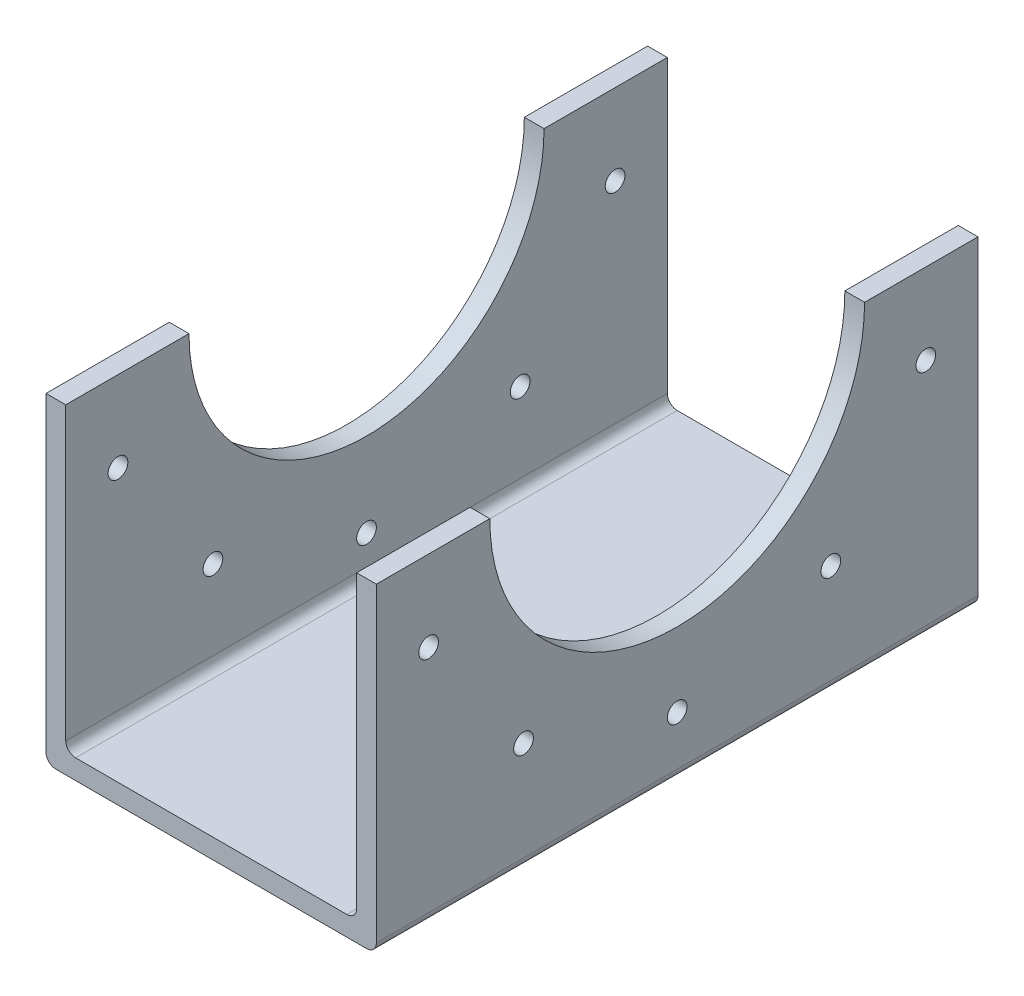
ISO-10303-21;
HEADER;
FILE_DESCRIPTION(('STEP AP214'),'2;1');
FILE_NAME('part.step','',(''),(''),'','','');
FILE_SCHEMA(('AUTOMOTIVE_DESIGN { 1 0 10303 214 1 1 1 1 }'));
ENDSEC;
DATA;
#1=APPLICATION_CONTEXT('core data for automotive mechanical design processes');
#2=APPLICATION_PROTOCOL_DEFINITION('international standard','automotive_design',2000,#1);
#3=PRODUCT_CONTEXT('',#1,'mechanical');
#4=PRODUCT('Part','Part','',(#3));
#5=PRODUCT_RELATED_PRODUCT_CATEGORY('part','',(#4));
#6=PRODUCT_DEFINITION_FORMATION('','',#4);
#7=PRODUCT_DEFINITION_CONTEXT('part definition',#1,'design');
#8=PRODUCT_DEFINITION('design','',#6,#7);
#9=PRODUCT_DEFINITION_SHAPE('','',#8);
#10=(LENGTH_UNIT() NAMED_UNIT(*) SI_UNIT(.MILLI.,.METRE.));
#11=(NAMED_UNIT(*) PLANE_ANGLE_UNIT() SI_UNIT($,.RADIAN.));
#12=(NAMED_UNIT(*) SI_UNIT($,.STERADIAN.) SOLID_ANGLE_UNIT());
#13=UNCERTAINTY_MEASURE_WITH_UNIT(LENGTH_MEASURE(1.E-05),#10,'distance_accuracy_value','');
#14=(GEOMETRIC_REPRESENTATION_CONTEXT(3) GLOBAL_UNCERTAINTY_ASSIGNED_CONTEXT((#13)) GLOBAL_UNIT_ASSIGNED_CONTEXT((#10,
#11,#12)) REPRESENTATION_CONTEXT('',''));
#15=CARTESIAN_POINT('',(0.,0.,0.));
#16=DIRECTION('',(0.,0.,1.));
#17=DIRECTION('',(1.,0.,0.));
#18=AXIS2_PLACEMENT_3D('',#15,#16,#17);
#19=CARTESIAN_POINT('',(0.,65.,0.));
#20=DIRECTION('',(0.,1.,0.));
#21=DIRECTION('',(0.,0.,1.));
#22=AXIS2_PLACEMENT_3D('',#19,#20,#21);
#23=PLANE('',#22);
#24=DIRECTION('',(-1.,0.,0.));
#25=VECTOR('',#24,1.);
#26=CARTESIAN_POINT('',(-22.5,65.,-36.));
#27=LINE('',#26,#25);
#28=CARTESIAN_POINT('',(-29.5,65.,-36.));
#29=VERTEX_POINT('',#28);
#30=CARTESIAN_POINT('',(-33.5,65.,-36.));
#31=VERTEX_POINT('',#30);
#32=EDGE_CURVE('E11',#29,#31,#27,.T.);
#33=ORIENTED_EDGE('',*,*,#32,.F.);
#34=DIRECTION('',(0.,0.,-1.));
#35=VECTOR('',#34,1.);
#36=CARTESIAN_POINT('',(-29.5,65.,-61.));
#37=LINE('',#36,#35);
#38=CARTESIAN_POINT('',(-29.5,65.,-61.));
#39=VERTEX_POINT('',#38);
#40=EDGE_CURVE('E169',#29,#39,#37,.T.);
#41=ORIENTED_EDGE('',*,*,#40,.T.);
#42=DIRECTION('',(-1.,0.,0.));
#43=VECTOR('',#42,1.);
#44=CARTESIAN_POINT('',(-33.5,65.,-61.));
#45=LINE('',#44,#43);
#46=CARTESIAN_POINT('',(-33.5,65.,-61.));
#47=VERTEX_POINT('',#46);
#48=EDGE_CURVE('E166',#39,#47,#45,.T.);
#49=ORIENTED_EDGE('',*,*,#48,.T.);
#50=DIRECTION('',(0.,0.,1.));
#51=VECTOR('',#50,1.);
#52=CARTESIAN_POINT('',(-33.5,65.,-61.));
#53=LINE('',#52,#51);
#54=EDGE_CURVE('E159',#47,#31,#53,.T.);
#55=ORIENTED_EDGE('',*,*,#54,.T.);
#56=EDGE_LOOP('',(#33,#41,#49,#55));
#57=FACE_BOUND('',#56,.T.);
#58=ADVANCED_FACE('F36',(#57),#23,.T.);
#59=CARTESIAN_POINT('',(0.,65.,0.));
#60=DIRECTION('',(0.,-1.,0.));
#61=DIRECTION('',(0.,0.,-1.));
#62=AXIS2_PLACEMENT_3D('',#59,#60,#61);
#63=PLANE('',#62);
#64=DIRECTION('',(0.,0.,1.));
#65=VECTOR('',#64,1.);
#66=CARTESIAN_POINT('',(29.5,65.,-61.));
#67=LINE('',#66,#65);
#68=CARTESIAN_POINT('',(29.5,65.,-61.));
#69=VERTEX_POINT('',#68);
#70=CARTESIAN_POINT('',(29.5,65.,-38.));
#71=VERTEX_POINT('',#70);
#72=EDGE_CURVE('E309',#69,#71,#67,.T.);
#73=ORIENTED_EDGE('',*,*,#72,.T.);
#74=DIRECTION('',(1.,0.,0.));
#75=VECTOR('',#74,1.);
#76=CARTESIAN_POINT('',(22.5,65.,-38.));
#77=LINE('',#76,#75);
#78=CARTESIAN_POINT('',(33.5,65.,-38.));
#79=VERTEX_POINT('',#78);
#80=EDGE_CURVE('E246',#71,#79,#77,.T.);
#81=ORIENTED_EDGE('',*,*,#80,.T.);
#82=DIRECTION('',(0.,0.,-1.));
#83=VECTOR('',#82,1.);
#84=CARTESIAN_POINT('',(33.5,65.,-61.));
#85=LINE('',#84,#83);
#86=CARTESIAN_POINT('',(33.5,65.,-61.));
#87=VERTEX_POINT('',#86);
#88=EDGE_CURVE('E264',#79,#87,#85,.T.);
#89=ORIENTED_EDGE('',*,*,#88,.T.);
#90=DIRECTION('',(-1.,0.,0.));
#91=VECTOR('',#90,1.);
#92=CARTESIAN_POINT('',(33.5,65.,-61.));
#93=LINE('',#92,#91);
#94=EDGE_CURVE('E306',#87,#69,#93,.T.);
#95=ORIENTED_EDGE('',*,*,#94,.T.);
#96=EDGE_LOOP('',(#73,#81,#89,#95));
#97=FACE_BOUND('',#96,.T.);
#98=ADVANCED_FACE('F373',(#97),#63,.F.);
#99=CARTESIAN_POINT('',(0.,4.,0.));
#100=DIRECTION('',(0.,1.,0.));
#101=DIRECTION('',(0.,0.,1.));
#102=AXIS2_PLACEMENT_3D('',#99,#100,#101);
#103=PLANE('',#102);
#104=DIRECTION('',(1.,0.,0.));
#105=VECTOR('',#104,1.);
#106=CARTESIAN_POINT('',(33.5,4.,61.));
#107=LINE('',#106,#105);
#108=CARTESIAN_POINT('',(-27.5,4.,61.));
#109=VERTEX_POINT('',#108);
#110=CARTESIAN_POINT('',(27.5,4.,61.));
#111=VERTEX_POINT('',#110);
#112=EDGE_CURVE('E186',#109,#111,#107,.T.);
#113=ORIENTED_EDGE('',*,*,#112,.T.);
#114=DIRECTION('',(0.,0.,1.));
#115=VECTOR('',#114,1.);
#116=CARTESIAN_POINT('',(27.5,4.,0.));
#117=LINE('',#116,#115);
#118=CARTESIAN_POINT('',(27.5,4.,-61.));
#119=VERTEX_POINT('',#118);
#120=EDGE_CURVE('E231',#111,#119,#117,.F.);
#121=ORIENTED_EDGE('',*,*,#120,.T.);
#122=DIRECTION('',(-1.,0.,0.));
#123=VECTOR('',#122,1.);
#124=CARTESIAN_POINT('',(33.5,4.,-61.));
#125=LINE('',#124,#123);
#126=CARTESIAN_POINT('',(-27.5,4.,-61.));
#127=VERTEX_POINT('',#126);
#128=EDGE_CURVE('E189',#119,#127,#125,.T.);
#129=ORIENTED_EDGE('',*,*,#128,.T.);
#130=DIRECTION('',(0.,0.,-1.));
#131=VECTOR('',#130,1.);
#132=CARTESIAN_POINT('',(-27.5,4.,0.));
#133=LINE('',#132,#131);
#134=EDGE_CURVE('E229',#127,#109,#133,.F.);
#135=ORIENTED_EDGE('',*,*,#134,.T.);
#136=EDGE_LOOP('',(#113,#121,#129,#135));
#137=FACE_BOUND('',#136,.T.);
#138=ADVANCED_FACE('F336',(#137),#103,.T.);
#139=CARTESIAN_POINT('',(-33.5,4.,61.));
#140=DIRECTION('',(1.,0.,0.));
#141=DIRECTION('',(0.,0.,-1.));
#142=AXIS2_PLACEMENT_3D('',#139,#140,#141);
#143=PLANE('',#142);
#144=CARTESIAN_POINT('',(-33.5,12.,0.));
#145=DIRECTION('',(-1.,0.,0.));
#146=DIRECTION('',(0.,0.,1.));
#147=AXIS2_PLACEMENT_3D('',#144,#145,#146);
#148=CIRCLE('',#147,2.);
#149=CARTESIAN_POINT('',(-33.5,12.,2.));
#150=VERTEX_POINT('',#149);
#151=EDGE_CURVE('E592',#150,#150,#148,.T.);
#152=ORIENTED_EDGE('',*,*,#151,.F.);
#153=EDGE_LOOP('',(#152));
#154=FACE_BOUND('',#153,.T.);
#155=CARTESIAN_POINT('',(-33.5,48.6220992981278,50.4059953636431));
#156=DIRECTION('',(-1.,0.,0.));
#157=DIRECTION('',(0.,0.,1.));
#158=AXIS2_PLACEMENT_3D('',#155,#156,#157);
#159=CIRCLE('',#158,2.);
#160=CARTESIAN_POINT('',(-33.5,48.6220992981278,52.4059953636432));
#161=VERTEX_POINT('',#160);
#162=EDGE_CURVE('E593',#161,#161,#159,.T.);
#163=ORIENTED_EDGE('',*,*,#162,.F.);
#164=EDGE_LOOP('',(#163));
#165=FACE_BOUND('',#164,.T.);
#166=CARTESIAN_POINT('',(-33.5,22.1220992981278,31.1526183715011));
#167=DIRECTION('',(-1.,0.,0.));
#168=DIRECTION('',(0.,0.,1.));
#169=AXIS2_PLACEMENT_3D('',#166,#167,#168);
#170=CIRCLE('',#169,2.);
#171=CARTESIAN_POINT('',(-33.5,22.1220992981278,33.1526183715011));
#172=VERTEX_POINT('',#171);
#173=EDGE_CURVE('E596',#172,#172,#170,.T.);
#174=ORIENTED_EDGE('',*,*,#173,.F.);
#175=EDGE_LOOP('',(#174));
#176=FACE_BOUND('',#175,.T.);
#177=CARTESIAN_POINT('',(-33.5,22.1220992981278,-31.1526183715011));
#178=DIRECTION('',(-1.,0.,0.));
#179=DIRECTION('',(0.,0.,1.));
#180=AXIS2_PLACEMENT_3D('',#177,#178,#179);
#181=CIRCLE('',#180,2.);
#182=CARTESIAN_POINT('',(-33.5,22.1220992981278,-29.1526183715011));
#183=VERTEX_POINT('',#182);
#184=EDGE_CURVE('E601',#183,#183,#181,.T.);
#185=ORIENTED_EDGE('',*,*,#184,.F.);
#186=EDGE_LOOP('',(#185));
#187=FACE_BOUND('',#186,.T.);
#188=CARTESIAN_POINT('',(-33.5,48.6220992981278,-50.4059953636431));
#189=DIRECTION('',(-1.,0.,0.));
#190=DIRECTION('',(0.,0.,1.));
#191=AXIS2_PLACEMENT_3D('',#188,#189,#190);
#192=CIRCLE('',#191,1.99999999999984);
#193=CARTESIAN_POINT('',(-33.5,48.6220992981278,-48.4059953636433));
#194=VERTEX_POINT('',#193);
#195=EDGE_CURVE('E162',#194,#194,#192,.T.);
#196=ORIENTED_EDGE('',*,*,#195,.F.);
#197=EDGE_LOOP('',(#196));
#198=FACE_BOUND('',#197,.T.);
#199=CARTESIAN_POINT('',(-33.5,65.,36.));
#200=VERTEX_POINT('',#199);
#201=CARTESIAN_POINT('',(-33.5,65.,61.));
#202=VERTEX_POINT('',#201);
#203=EDGE_CURVE('E161',#200,#202,#53,.T.);
#204=ORIENTED_EDGE('',*,*,#203,.F.);
#205=CARTESIAN_POINT('',(-33.5,65.,0.));
#206=DIRECTION('',(-1.,0.,0.));
#207=DIRECTION('',(0.,0.,1.));
#208=AXIS2_PLACEMENT_3D('',#205,#206,#207);
#209=CIRCLE('',#208,36.);
#210=EDGE_CURVE('E52',#31,#200,#209,.T.);
#211=ORIENTED_EDGE('',*,*,#210,.F.);
#212=ORIENTED_EDGE('',*,*,#54,.F.);
#213=DIRECTION('',(0.,-1.,0.));
#214=VECTOR('',#213,1.);
#215=CARTESIAN_POINT('',(-33.5,4.,-61.));
#216=LINE('',#215,#214);
#217=CARTESIAN_POINT('',(-33.5,2.,-61.));
#218=VERTEX_POINT('',#217);
#219=EDGE_CURVE('E193',#47,#218,#216,.T.);
#220=ORIENTED_EDGE('',*,*,#219,.T.);
#221=DIRECTION('',(0.,0.,1.));
#222=VECTOR('',#221,1.);
#223=CARTESIAN_POINT('',(-33.5,2.,61.));
#224=LINE('',#223,#222);
#225=CARTESIAN_POINT('',(-33.5,2.,61.));
#226=VERTEX_POINT('',#225);
#227=EDGE_CURVE('E208',#218,#226,#224,.T.);
#228=ORIENTED_EDGE('',*,*,#227,.T.);
#229=DIRECTION('',(0.,-1.,0.));
#230=VECTOR('',#229,1.);
#231=CARTESIAN_POINT('',(-33.5,4.,61.));
#232=LINE('',#231,#230);
#233=EDGE_CURVE('E205',#202,#226,#232,.T.);
#234=ORIENTED_EDGE('',*,*,#233,.F.);
#235=EDGE_LOOP('',(#204,#211,#212,#220,#228,#234));
#236=FACE_BOUND('',#235,.T.);
#237=ADVANCED_FACE('F157',(#154,#165,#176,#187,#198,#236),#143,.F.);
#238=CARTESIAN_POINT('',(33.5,4.,61.));
#239=DIRECTION('',(0.,0.,-1.));
#240=DIRECTION('',(-1.,0.,0.));
#241=AXIS2_PLACEMENT_3D('',#238,#239,#240);
#242=PLANE('',#241);
#243=ORIENTED_EDGE('',*,*,#233,.T.);
#244=CARTESIAN_POINT('',(-31.5,2.,61.));
#245=DIRECTION('',(0.,0.,-1.));
#246=DIRECTION('',(-1.,0.,0.));
#247=AXIS2_PLACEMENT_3D('',#244,#245,#246);
#248=CIRCLE('',#247,2.);
#249=CARTESIAN_POINT('',(-31.5,0.,61.));
#250=VERTEX_POINT('',#249);
#251=EDGE_CURVE('E213',#226,#250,#248,.F.);
#252=ORIENTED_EDGE('',*,*,#251,.T.);
#253=DIRECTION('',(1.,0.,0.));
#254=VECTOR('',#253,1.);
#255=CARTESIAN_POINT('',(33.5,0.,61.));
#256=LINE('',#255,#254);
#257=CARTESIAN_POINT('',(31.5,0.,61.));
#258=VERTEX_POINT('',#257);
#259=EDGE_CURVE('E185',#250,#258,#256,.T.);
#260=ORIENTED_EDGE('',*,*,#259,.T.);
#261=CARTESIAN_POINT('',(31.5,2.,61.));
#262=DIRECTION('',(0.,0.,-1.));
#263=DIRECTION('',(-1.,0.,0.));
#264=AXIS2_PLACEMENT_3D('',#261,#262,#263);
#265=CIRCLE('',#264,2.);
#266=CARTESIAN_POINT('',(33.5,2.,61.));
#267=VERTEX_POINT('',#266);
#268=EDGE_CURVE('E211',#258,#267,#265,.F.);
#269=ORIENTED_EDGE('',*,*,#268,.T.);
#270=DIRECTION('',(0.,-1.,0.));
#271=VECTOR('',#270,1.);
#272=CARTESIAN_POINT('',(33.5,4.,61.));
#273=LINE('',#272,#271);
#274=CARTESIAN_POINT('',(33.5,65.,61.));
#275=VERTEX_POINT('',#274);
#276=EDGE_CURVE('E202',#275,#267,#273,.T.);
#277=ORIENTED_EDGE('',*,*,#276,.F.);
#278=DIRECTION('',(1.,0.,0.));
#279=VECTOR('',#278,1.);
#280=CARTESIAN_POINT('',(33.5,65.,61.));
#281=LINE('',#280,#279);
#282=CARTESIAN_POINT('',(29.5,65.,61.));
#283=VERTEX_POINT('',#282);
#284=EDGE_CURVE('E312',#283,#275,#281,.T.);
#285=ORIENTED_EDGE('',*,*,#284,.F.);
#286=DIRECTION('',(0.,-1.,0.));
#287=VECTOR('',#286,1.);
#288=CARTESIAN_POINT('',(29.5,65.,61.));
#289=LINE('',#288,#287);
#290=CARTESIAN_POINT('',(29.5,6.00000000000001,61.));
#291=VERTEX_POINT('',#290);
#292=EDGE_CURVE('E314',#283,#291,#289,.T.);
#293=ORIENTED_EDGE('',*,*,#292,.T.);
#294=CARTESIAN_POINT('',(27.5,6.,61.));
#295=DIRECTION('',(0.,0.,-1.));
#296=DIRECTION('',(-1.,0.,0.));
#297=AXIS2_PLACEMENT_3D('',#294,#295,#296);
#298=CIRCLE('',#297,2.);
#299=EDGE_CURVE('E236',#291,#111,#298,.T.);
#300=ORIENTED_EDGE('',*,*,#299,.T.);
#301=ORIENTED_EDGE('',*,*,#112,.F.);
#302=CARTESIAN_POINT('',(-27.5,6.,61.));
#303=DIRECTION('',(0.,0.,-1.));
#304=DIRECTION('',(-1.,0.,0.));
#305=AXIS2_PLACEMENT_3D('',#302,#303,#304);
#306=CIRCLE('',#305,2.);
#307=CARTESIAN_POINT('',(-29.5,6.00000000000001,61.));
#308=VERTEX_POINT('',#307);
#309=EDGE_CURVE('E242',#109,#308,#306,.T.);
#310=ORIENTED_EDGE('',*,*,#309,.T.);
#311=DIRECTION('',(0.,-1.,0.));
#312=VECTOR('',#311,1.);
#313=CARTESIAN_POINT('',(-29.5,65.,61.));
#314=LINE('',#313,#312);
#315=CARTESIAN_POINT('',(-29.5,65.,61.));
#316=VERTEX_POINT('',#315);
#317=EDGE_CURVE('E182',#316,#308,#314,.T.);
#318=ORIENTED_EDGE('',*,*,#317,.F.);
#319=DIRECTION('',(1.,0.,0.));
#320=VECTOR('',#319,1.);
#321=CARTESIAN_POINT('',(-33.5,65.,61.));
#322=LINE('',#321,#320);
#323=EDGE_CURVE('E167',#202,#316,#322,.T.);
#324=ORIENTED_EDGE('',*,*,#323,.F.);
#325=EDGE_LOOP('',(#243,#252,#260,#269,#277,#285,#293,#300,#301,#310,#318,#324));
#326=FACE_BOUND('',#325,.T.);
#327=ADVANCED_FACE('F333',(#326),#242,.F.);
#328=CARTESIAN_POINT('',(33.5,4.,61.));
#329=DIRECTION('',(-1.,0.,0.));
#330=DIRECTION('',(0.,0.,1.));
#331=AXIS2_PLACEMENT_3D('',#328,#329,#330);
#332=PLANE('',#331);
#333=CARTESIAN_POINT('',(33.5,12.,0.));
#334=DIRECTION('',(1.,0.,0.));
#335=DIRECTION('',(0.,0.,-1.));
#336=AXIS2_PLACEMENT_3D('',#333,#334,#335);
#337=CIRCLE('',#336,2.00000000000001);
#338=CARTESIAN_POINT('',(33.5,12.,-2.00000000000001));
#339=VERTEX_POINT('',#338);
#340=EDGE_CURVE('E292',#339,#339,#337,.T.);
#341=ORIENTED_EDGE('',*,*,#340,.F.);
#342=EDGE_LOOP('',(#341));
#343=FACE_BOUND('',#342,.T.);
#344=CARTESIAN_POINT('',(33.5,22.1220992981278,31.1526183715011));
#345=DIRECTION('',(1.,0.,0.));
#346=DIRECTION('',(0.,0.,-1.));
#347=AXIS2_PLACEMENT_3D('',#344,#345,#346);
#348=CIRCLE('',#347,2.);
#349=CARTESIAN_POINT('',(33.5,22.1220992981278,29.1526183715011));
#350=VERTEX_POINT('',#349);
#351=EDGE_CURVE('E296',#350,#350,#348,.T.);
#352=ORIENTED_EDGE('',*,*,#351,.F.);
#353=EDGE_LOOP('',(#352));
#354=FACE_BOUND('',#353,.T.);
#355=CARTESIAN_POINT('',(33.5,48.6220992981278,50.4059953636431));
#356=DIRECTION('',(1.,0.,0.));
#357=DIRECTION('',(0.,0.,-1.));
#358=AXIS2_PLACEMENT_3D('',#355,#356,#357);
#359=CIRCLE('',#358,1.99999999999985);
#360=CARTESIAN_POINT('',(33.5,48.6220992981278,48.4059953636433));
#361=VERTEX_POINT('',#360);
#362=EDGE_CURVE('E288',#361,#361,#359,.T.);
#363=ORIENTED_EDGE('',*,*,#362,.F.);
#364=EDGE_LOOP('',(#363));
#365=FACE_BOUND('',#364,.T.);
#366=CARTESIAN_POINT('',(33.5,48.6220992981278,-50.4059953636431));
#367=DIRECTION('',(1.,0.,0.));
#368=DIRECTION('',(0.,0.,-1.));
#369=AXIS2_PLACEMENT_3D('',#366,#367,#368);
#370=CIRCLE('',#369,2.);
#371=CARTESIAN_POINT('',(33.5,48.6220992981278,-52.4059953636432));
#372=VERTEX_POINT('',#371);
#373=EDGE_CURVE('E283',#372,#372,#370,.T.);
#374=ORIENTED_EDGE('',*,*,#373,.F.);
#375=EDGE_LOOP('',(#374));
#376=FACE_BOUND('',#375,.T.);
#377=CARTESIAN_POINT('',(33.5,22.1220992981278,-31.1526183715011));
#378=DIRECTION('',(1.,0.,0.));
#379=DIRECTION('',(0.,0.,-1.));
#380=AXIS2_PLACEMENT_3D('',#377,#378,#379);
#381=CIRCLE('',#380,2.);
#382=CARTESIAN_POINT('',(33.5,22.1220992981278,-33.1526183715011));
#383=VERTEX_POINT('',#382);
#384=EDGE_CURVE('E279',#383,#383,#381,.T.);
#385=ORIENTED_EDGE('',*,*,#384,.F.);
#386=EDGE_LOOP('',(#385));
#387=FACE_BOUND('',#386,.T.);
#388=ORIENTED_EDGE('',*,*,#88,.F.);
#389=CARTESIAN_POINT('',(33.5,65.,0.));
#390=DIRECTION('',(1.,0.,0.));
#391=DIRECTION('',(0.,0.,-1.));
#392=AXIS2_PLACEMENT_3D('',#389,#390,#391);
#393=CIRCLE('',#392,38.);
#394=CARTESIAN_POINT('',(33.5,65.,38.));
#395=VERTEX_POINT('',#394);
#396=EDGE_CURVE('E295',#395,#79,#393,.T.);
#397=ORIENTED_EDGE('',*,*,#396,.F.);
#398=EDGE_CURVE('E303',#275,#395,#85,.T.);
#399=ORIENTED_EDGE('',*,*,#398,.F.);
#400=ORIENTED_EDGE('',*,*,#276,.T.);
#401=DIRECTION('',(0.,0.,-1.));
#402=VECTOR('',#401,1.);
#403=CARTESIAN_POINT('',(33.5,2.,61.));
#404=LINE('',#403,#402);
#405=CARTESIAN_POINT('',(33.5,2.,-61.));
#406=VERTEX_POINT('',#405);
#407=EDGE_CURVE('E223',#267,#406,#404,.T.);
#408=ORIENTED_EDGE('',*,*,#407,.T.);
#409=DIRECTION('',(0.,-1.,0.));
#410=VECTOR('',#409,1.);
#411=CARTESIAN_POINT('',(33.5,4.,-61.));
#412=LINE('',#411,#410);
#413=EDGE_CURVE('E199',#87,#406,#412,.T.);
#414=ORIENTED_EDGE('',*,*,#413,.F.);
#415=EDGE_LOOP('',(#388,#397,#399,#400,#408,#414));
#416=FACE_BOUND('',#415,.T.);
#417=ADVANCED_FACE('F367',(#343,#354,#365,#376,#387,#416),#332,.F.);
#418=CARTESIAN_POINT('',(33.5,4.,-61.));
#419=DIRECTION('',(0.,0.,1.));
#420=DIRECTION('',(1.,0.,0.));
#421=AXIS2_PLACEMENT_3D('',#418,#419,#420);
#422=PLANE('',#421);
#423=DIRECTION('',(-1.,0.,0.));
#424=VECTOR('',#423,1.);
#425=CARTESIAN_POINT('',(33.5,0.,-61.));
#426=LINE('',#425,#424);
#427=CARTESIAN_POINT('',(31.5,0.,-61.));
#428=VERTEX_POINT('',#427);
#429=CARTESIAN_POINT('',(-31.5,0.,-61.));
#430=VERTEX_POINT('',#429);
#431=EDGE_CURVE('E190',#428,#430,#426,.T.);
#432=ORIENTED_EDGE('',*,*,#431,.T.);
#433=CARTESIAN_POINT('',(-31.5,2.,-61.));
#434=DIRECTION('',(0.,0.,1.));
#435=DIRECTION('',(1.,0.,0.));
#436=AXIS2_PLACEMENT_3D('',#433,#434,#435);
#437=CIRCLE('',#436,2.);
#438=EDGE_CURVE('E221',#430,#218,#437,.F.);
#439=ORIENTED_EDGE('',*,*,#438,.T.);
#440=ORIENTED_EDGE('',*,*,#219,.F.);
#441=ORIENTED_EDGE('',*,*,#48,.F.);
#442=DIRECTION('',(0.,-1.,0.));
#443=VECTOR('',#442,1.);
#444=CARTESIAN_POINT('',(-29.5,65.,-61.));
#445=LINE('',#444,#443);
#446=CARTESIAN_POINT('',(-29.5,6.00000000000001,-61.));
#447=VERTEX_POINT('',#446);
#448=EDGE_CURVE('E179',#39,#447,#445,.T.);
#449=ORIENTED_EDGE('',*,*,#448,.T.);
#450=CARTESIAN_POINT('',(-27.5,6.,-61.));
#451=DIRECTION('',(0.,0.,1.));
#452=DIRECTION('',(1.,0.,0.));
#453=AXIS2_PLACEMENT_3D('',#450,#451,#452);
#454=CIRCLE('',#453,2.);
#455=EDGE_CURVE('E240',#447,#127,#454,.T.);
#456=ORIENTED_EDGE('',*,*,#455,.T.);
#457=ORIENTED_EDGE('',*,*,#128,.F.);
#458=CARTESIAN_POINT('',(27.5,6.,-61.));
#459=DIRECTION('',(0.,0.,1.));
#460=DIRECTION('',(1.,0.,0.));
#461=AXIS2_PLACEMENT_3D('',#458,#459,#460);
#462=CIRCLE('',#461,2.);
#463=CARTESIAN_POINT('',(29.5,6.00000000000001,-61.));
#464=VERTEX_POINT('',#463);
#465=EDGE_CURVE('E238',#119,#464,#462,.T.);
#466=ORIENTED_EDGE('',*,*,#465,.T.);
#467=DIRECTION('',(0.,-1.,0.));
#468=VECTOR('',#467,1.);
#469=CARTESIAN_POINT('',(29.5,65.,-61.));
#470=LINE('',#469,#468);
#471=EDGE_CURVE('E171',#69,#464,#470,.T.);
#472=ORIENTED_EDGE('',*,*,#471,.F.);
#473=ORIENTED_EDGE('',*,*,#94,.F.);
#474=ORIENTED_EDGE('',*,*,#413,.T.);
#475=CARTESIAN_POINT('',(31.5,2.,-61.));
#476=DIRECTION('',(0.,0.,1.));
#477=DIRECTION('',(1.,0.,0.));
#478=AXIS2_PLACEMENT_3D('',#475,#476,#477);
#479=CIRCLE('',#478,2.);
#480=EDGE_CURVE('E219',#406,#428,#479,.F.);
#481=ORIENTED_EDGE('',*,*,#480,.T.);
#482=EDGE_LOOP('',(#432,#439,#440,#441,#449,#456,#457,#466,#472,#473,#474,#481));
#483=FACE_BOUND('',#482,.T.);
#484=ADVANCED_FACE('F359',(#483),#422,.F.);
#485=CARTESIAN_POINT('',(0.,0.,0.));
#486=DIRECTION('',(0.,1.,0.));
#487=DIRECTION('',(0.,0.,1.));
#488=AXIS2_PLACEMENT_3D('',#485,#486,#487);
#489=PLANE('',#488);
#490=ORIENTED_EDGE('',*,*,#259,.F.);
#491=DIRECTION('',(0.,0.,1.));
#492=VECTOR('',#491,1.);
#493=CARTESIAN_POINT('',(-31.5,0.,0.));
#494=LINE('',#493,#492);
#495=EDGE_CURVE('E217',#250,#430,#494,.F.);
#496=ORIENTED_EDGE('',*,*,#495,.T.);
#497=ORIENTED_EDGE('',*,*,#431,.F.);
#498=DIRECTION('',(0.,0.,-1.));
#499=VECTOR('',#498,1.);
#500=CARTESIAN_POINT('',(31.5,0.,0.));
#501=LINE('',#500,#499);
#502=EDGE_CURVE('E215',#428,#258,#501,.F.);
#503=ORIENTED_EDGE('',*,*,#502,.T.);
#504=EDGE_LOOP('',(#490,#496,#497,#503));
#505=FACE_BOUND('',#504,.T.);
#506=ADVANCED_FACE('F357',(#505),#489,.F.);
#507=CARTESIAN_POINT('',(-29.5,65.,-61.));
#508=DIRECTION('',(-1.,0.,0.));
#509=DIRECTION('',(0.,0.,1.));
#510=AXIS2_PLACEMENT_3D('',#507,#508,#509);
#511=PLANE('',#510);
#512=CARTESIAN_POINT('',(-29.5,12.,0.));
#513=DIRECTION('',(-1.,0.,0.));
#514=DIRECTION('',(0.,0.,1.));
#515=AXIS2_PLACEMENT_3D('',#512,#513,#514);
#516=CIRCLE('',#515,2.);
#517=CARTESIAN_POINT('',(-29.5,12.,2.));
#518=VERTEX_POINT('',#517);
#519=EDGE_CURVE('E40',#518,#518,#516,.T.);
#520=ORIENTED_EDGE('',*,*,#519,.T.);
#521=EDGE_LOOP('',(#520));
#522=FACE_BOUND('',#521,.T.);
#523=CARTESIAN_POINT('',(-29.5,48.6220992981278,50.4059953636431));
#524=DIRECTION('',(-1.,0.,0.));
#525=DIRECTION('',(0.,0.,1.));
#526=AXIS2_PLACEMENT_3D('',#523,#524,#525);
#527=CIRCLE('',#526,2.);
#528=CARTESIAN_POINT('',(-29.5,48.6220992981278,52.4059953636432));
#529=VERTEX_POINT('',#528);
#530=EDGE_CURVE('E274',#529,#529,#527,.T.);
#531=ORIENTED_EDGE('',*,*,#530,.T.);
#532=EDGE_LOOP('',(#531));
#533=FACE_BOUND('',#532,.T.);
#534=CARTESIAN_POINT('',(-29.5,22.1220992981278,31.1526183715011));
#535=DIRECTION('',(-1.,0.,0.));
#536=DIRECTION('',(0.,0.,1.));
#537=AXIS2_PLACEMENT_3D('',#534,#535,#536);
#538=CIRCLE('',#537,2.);
#539=CARTESIAN_POINT('',(-29.5,22.1220992981278,33.1526183715011));
#540=VERTEX_POINT('',#539);
#541=EDGE_CURVE('E272',#540,#540,#538,.T.);
#542=ORIENTED_EDGE('',*,*,#541,.T.);
#543=EDGE_LOOP('',(#542));
#544=FACE_BOUND('',#543,.T.);
#545=CARTESIAN_POINT('',(-29.5,22.1220992981278,-31.1526183715011));
#546=DIRECTION('',(-1.,0.,0.));
#547=DIRECTION('',(0.,0.,1.));
#548=AXIS2_PLACEMENT_3D('',#545,#546,#547);
#549=CIRCLE('',#548,2.);
#550=CARTESIAN_POINT('',(-29.5,22.1220992981278,-29.1526183715011));
#551=VERTEX_POINT('',#550);
#552=EDGE_CURVE('E269',#551,#551,#549,.T.);
#553=ORIENTED_EDGE('',*,*,#552,.T.);
#554=EDGE_LOOP('',(#553));
#555=FACE_BOUND('',#554,.T.);
#556=CARTESIAN_POINT('',(-29.5,48.6220992981278,-50.4059953636431));
#557=DIRECTION('',(-1.,0.,0.));
#558=DIRECTION('',(0.,0.,1.));
#559=AXIS2_PLACEMENT_3D('',#556,#557,#558);
#560=CIRCLE('',#559,1.99999999999984);
#561=CARTESIAN_POINT('',(-29.5,48.6220992981278,-48.4059953636433));
#562=VERTEX_POINT('',#561);
#563=EDGE_CURVE('E266',#562,#562,#560,.T.);
#564=ORIENTED_EDGE('',*,*,#563,.T.);
#565=EDGE_LOOP('',(#564));
#566=FACE_BOUND('',#565,.T.);
#567=ORIENTED_EDGE('',*,*,#40,.F.);
#568=CARTESIAN_POINT('',(-29.5,65.,0.));
#569=DIRECTION('',(-1.,0.,0.));
#570=DIRECTION('',(0.,0.,1.));
#571=AXIS2_PLACEMENT_3D('',#568,#569,#570);
#572=CIRCLE('',#571,36.);
#573=CARTESIAN_POINT('',(-29.5,65.,36.));
#574=VERTEX_POINT('',#573);
#575=EDGE_CURVE('E150',#29,#574,#572,.T.);
#576=ORIENTED_EDGE('',*,*,#575,.T.);
#577=EDGE_CURVE('E175',#316,#574,#37,.T.);
#578=ORIENTED_EDGE('',*,*,#577,.F.);
#579=ORIENTED_EDGE('',*,*,#317,.T.);
#580=DIRECTION('',(0.,0.,-1.));
#581=VECTOR('',#580,1.);
#582=CARTESIAN_POINT('',(-29.5,6.,-61.));
#583=LINE('',#582,#581);
#584=EDGE_CURVE('E233',#308,#447,#583,.T.);
#585=ORIENTED_EDGE('',*,*,#584,.T.);
#586=ORIENTED_EDGE('',*,*,#448,.F.);
#587=EDGE_LOOP('',(#567,#576,#578,#579,#585,#586));
#588=FACE_BOUND('',#587,.T.);
#589=ADVANCED_FACE('F345',(#522,#533,#544,#555,#566,#588),#511,.F.);
#590=DIRECTION('',(-1.,0.,0.));
#591=VECTOR('',#590,1.);
#592=CARTESIAN_POINT('',(-22.5,65.,36.));
#593=LINE('',#592,#591);
#594=EDGE_CURVE('E45',#200,#574,#593,.F.);
#595=ORIENTED_EDGE('',*,*,#594,.F.);
#596=ORIENTED_EDGE('',*,*,#203,.T.);
#597=ORIENTED_EDGE('',*,*,#323,.T.);
#598=ORIENTED_EDGE('',*,*,#577,.T.);
#599=EDGE_LOOP('',(#595,#596,#597,#598));
#600=FACE_BOUND('',#599,.T.);
#601=ADVANCED_FACE('F348',(#600),#23,.T.);
#602=CARTESIAN_POINT('',(29.5,65.,-61.));
#603=DIRECTION('',(1.,0.,0.));
#604=DIRECTION('',(0.,0.,-1.));
#605=AXIS2_PLACEMENT_3D('',#602,#603,#604);
#606=PLANE('',#605);
#607=CARTESIAN_POINT('',(29.5,12.,0.));
#608=DIRECTION('',(1.,0.,0.));
#609=DIRECTION('',(0.,0.,-1.));
#610=AXIS2_PLACEMENT_3D('',#607,#608,#609);
#611=CIRCLE('',#610,2.00000000000001);
#612=CARTESIAN_POINT('',(29.5,12.,-2.00000000000001));
#613=VERTEX_POINT('',#612);
#614=EDGE_CURVE('E261',#613,#613,#611,.T.);
#615=ORIENTED_EDGE('',*,*,#614,.T.);
#616=EDGE_LOOP('',(#615));
#617=FACE_BOUND('',#616,.T.);
#618=CARTESIAN_POINT('',(29.5,22.1220992981278,31.1526183715011));
#619=DIRECTION('',(1.,0.,0.));
#620=DIRECTION('',(0.,0.,-1.));
#621=AXIS2_PLACEMENT_3D('',#618,#619,#620);
#622=CIRCLE('',#621,2.);
#623=CARTESIAN_POINT('',(29.5,22.1220992981278,29.1526183715011));
#624=VERTEX_POINT('',#623);
#625=EDGE_CURVE('E258',#624,#624,#622,.T.);
#626=ORIENTED_EDGE('',*,*,#625,.T.);
#627=EDGE_LOOP('',(#626));
#628=FACE_BOUND('',#627,.T.);
#629=CARTESIAN_POINT('',(29.5,48.6220992981278,50.4059953636431));
#630=DIRECTION('',(1.,0.,0.));
#631=DIRECTION('',(0.,0.,-1.));
#632=AXIS2_PLACEMENT_3D('',#629,#630,#631);
#633=CIRCLE('',#632,1.99999999999985);
#634=CARTESIAN_POINT('',(29.5,48.6220992981278,48.4059953636433));
#635=VERTEX_POINT('',#634);
#636=EDGE_CURVE('E255',#635,#635,#633,.T.);
#637=ORIENTED_EDGE('',*,*,#636,.T.);
#638=EDGE_LOOP('',(#637));
#639=FACE_BOUND('',#638,.T.);
#640=CARTESIAN_POINT('',(29.5,48.6220992981278,-50.4059953636431));
#641=DIRECTION('',(1.,0.,0.));
#642=DIRECTION('',(0.,0.,-1.));
#643=AXIS2_PLACEMENT_3D('',#640,#641,#642);
#644=CIRCLE('',#643,2.);
#645=CARTESIAN_POINT('',(29.5,48.6220992981278,-52.4059953636432));
#646=VERTEX_POINT('',#645);
#647=EDGE_CURVE('E252',#646,#646,#644,.T.);
#648=ORIENTED_EDGE('',*,*,#647,.T.);
#649=EDGE_LOOP('',(#648));
#650=FACE_BOUND('',#649,.T.);
#651=CARTESIAN_POINT('',(29.5,22.1220992981278,-31.1526183715011));
#652=DIRECTION('',(1.,0.,0.));
#653=DIRECTION('',(0.,0.,-1.));
#654=AXIS2_PLACEMENT_3D('',#651,#652,#653);
#655=CIRCLE('',#654,2.);
#656=CARTESIAN_POINT('',(29.5,22.1220992981278,-33.1526183715011));
#657=VERTEX_POINT('',#656);
#658=EDGE_CURVE('E249',#657,#657,#655,.T.);
#659=ORIENTED_EDGE('',*,*,#658,.T.);
#660=EDGE_LOOP('',(#659));
#661=FACE_BOUND('',#660,.T.);
#662=CARTESIAN_POINT('',(29.5,65.,38.));
#663=VERTEX_POINT('',#662);
#664=EDGE_CURVE('E308',#663,#283,#67,.T.);
#665=ORIENTED_EDGE('',*,*,#664,.F.);
#666=CARTESIAN_POINT('',(29.5,65.,0.));
#667=DIRECTION('',(1.,0.,0.));
#668=DIRECTION('',(0.,0.,-1.));
#669=AXIS2_PLACEMENT_3D('',#666,#667,#668);
#670=CIRCLE('',#669,38.);
#671=EDGE_CURVE('E60',#663,#71,#670,.T.);
#672=ORIENTED_EDGE('',*,*,#671,.T.);
#673=ORIENTED_EDGE('',*,*,#72,.F.);
#674=ORIENTED_EDGE('',*,*,#471,.T.);
#675=DIRECTION('',(0.,0.,1.));
#676=VECTOR('',#675,1.);
#677=CARTESIAN_POINT('',(29.5,6.,-61.));
#678=LINE('',#677,#676);
#679=EDGE_CURVE('E226',#464,#291,#678,.T.);
#680=ORIENTED_EDGE('',*,*,#679,.T.);
#681=ORIENTED_EDGE('',*,*,#292,.F.);
#682=EDGE_LOOP('',(#665,#672,#673,#674,#680,#681));
#683=FACE_BOUND('',#682,.T.);
#684=ADVANCED_FACE('F325',(#617,#628,#639,#650,#661,#683),#606,.F.);
#685=ORIENTED_EDGE('',*,*,#398,.T.);
#686=DIRECTION('',(1.,0.,0.));
#687=VECTOR('',#686,1.);
#688=CARTESIAN_POINT('',(22.5,65.,38.));
#689=LINE('',#688,#687);
#690=EDGE_CURVE('E244',#395,#663,#689,.F.);
#691=ORIENTED_EDGE('',*,*,#690,.T.);
#692=ORIENTED_EDGE('',*,*,#664,.T.);
#693=ORIENTED_EDGE('',*,*,#284,.T.);
#694=EDGE_LOOP('',(#685,#691,#692,#693));
#695=FACE_BOUND('',#694,.T.);
#696=ADVANCED_FACE('F371',(#695),#63,.F.);
#697=CARTESIAN_POINT('',(-31.5,2.,61.));
#698=DIRECTION('',(0.,0.,1.));
#699=DIRECTION('',(1.,0.,0.));
#700=AXIS2_PLACEMENT_3D('',#697,#698,#699);
#701=CYLINDRICAL_SURFACE('',#700,2.);
#702=ORIENTED_EDGE('',*,*,#438,.F.);
#703=ORIENTED_EDGE('',*,*,#495,.F.);
#704=ORIENTED_EDGE('',*,*,#251,.F.);
#705=ORIENTED_EDGE('',*,*,#227,.F.);
#706=EDGE_LOOP('',(#702,#703,#704,#705));
#707=FACE_BOUND('',#706,.T.);
#708=ADVANCED_FACE('F353',(#707),#701,.T.);
#709=CARTESIAN_POINT('',(31.5,2.,61.));
#710=DIRECTION('',(0.,0.,-1.));
#711=DIRECTION('',(-1.,0.,0.));
#712=AXIS2_PLACEMENT_3D('',#709,#710,#711);
#713=CYLINDRICAL_SURFACE('',#712,2.);
#714=ORIENTED_EDGE('',*,*,#268,.F.);
#715=ORIENTED_EDGE('',*,*,#502,.F.);
#716=ORIENTED_EDGE('',*,*,#480,.F.);
#717=ORIENTED_EDGE('',*,*,#407,.F.);
#718=EDGE_LOOP('',(#714,#715,#716,#717));
#719=FACE_BOUND('',#718,.T.);
#720=ADVANCED_FACE('F364',(#719),#713,.T.);
#721=CARTESIAN_POINT('',(27.5,6.,-61.));
#722=DIRECTION('',(0.,0.,1.));
#723=DIRECTION('',(1.,0.,0.));
#724=AXIS2_PLACEMENT_3D('',#721,#722,#723);
#725=CYLINDRICAL_SURFACE('',#724,2.);
#726=ORIENTED_EDGE('',*,*,#465,.F.);
#727=ORIENTED_EDGE('',*,*,#120,.F.);
#728=ORIENTED_EDGE('',*,*,#299,.F.);
#729=ORIENTED_EDGE('',*,*,#679,.F.);
#730=EDGE_LOOP('',(#726,#727,#728,#729));
#731=FACE_BOUND('',#730,.T.);
#732=ADVANCED_FACE('F330',(#731),#725,.F.);
#733=CARTESIAN_POINT('',(-27.5,6.,-61.));
#734=DIRECTION('',(0.,0.,-1.));
#735=DIRECTION('',(-1.,0.,0.));
#736=AXIS2_PLACEMENT_3D('',#733,#734,#735);
#737=CYLINDRICAL_SURFACE('',#736,2.);
#738=ORIENTED_EDGE('',*,*,#309,.F.);
#739=ORIENTED_EDGE('',*,*,#134,.F.);
#740=ORIENTED_EDGE('',*,*,#455,.F.);
#741=ORIENTED_EDGE('',*,*,#584,.F.);
#742=EDGE_LOOP('',(#738,#739,#740,#741));
#743=FACE_BOUND('',#742,.T.);
#744=ADVANCED_FACE('F38',(#743),#737,.F.);
#745=CARTESIAN_POINT('',(22.5,65.,0.));
#746=DIRECTION('',(1.,0.,0.));
#747=DIRECTION('',(0.,0.,-1.));
#748=AXIS2_PLACEMENT_3D('',#745,#746,#747);
#749=CYLINDRICAL_SURFACE('',#748,38.);
#750=ORIENTED_EDGE('',*,*,#671,.F.);
#751=ORIENTED_EDGE('',*,*,#690,.F.);
#752=ORIENTED_EDGE('',*,*,#396,.T.);
#753=ORIENTED_EDGE('',*,*,#80,.F.);
#754=EDGE_LOOP('',(#750,#751,#752,#753));
#755=FACE_BOUND('',#754,.T.);
#756=ADVANCED_FACE('F374',(#755),#749,.F.);
#757=CARTESIAN_POINT('',(22.5,22.1220992981278,-31.1526183715011));
#758=DIRECTION('',(1.,0.,0.));
#759=DIRECTION('',(0.,0.,-1.));
#760=AXIS2_PLACEMENT_3D('',#757,#758,#759);
#761=CYLINDRICAL_SURFACE('',#760,2.);
#762=ORIENTED_EDGE('',*,*,#384,.T.);
#763=EDGE_LOOP('',(#762));
#764=FACE_BOUND('',#763,.T.);
#765=ORIENTED_EDGE('',*,*,#658,.F.);
#766=EDGE_LOOP('',(#765));
#767=FACE_BOUND('',#766,.T.);
#768=ADVANCED_FACE('F376',(#764,#767),#761,.F.);
#769=CARTESIAN_POINT('',(22.5,48.6220992981278,-50.4059953636431));
#770=DIRECTION('',(1.,0.,0.));
#771=DIRECTION('',(0.,0.,-1.));
#772=AXIS2_PLACEMENT_3D('',#769,#770,#771);
#773=CYLINDRICAL_SURFACE('',#772,2.);
#774=ORIENTED_EDGE('',*,*,#373,.T.);
#775=EDGE_LOOP('',(#774));
#776=FACE_BOUND('',#775,.T.);
#777=ORIENTED_EDGE('',*,*,#647,.F.);
#778=EDGE_LOOP('',(#777));
#779=FACE_BOUND('',#778,.T.);
#780=ADVANCED_FACE('F382',(#776,#779),#773,.F.);
#781=CARTESIAN_POINT('',(22.5,48.6220992981278,50.4059953636431));
#782=DIRECTION('',(1.,0.,0.));
#783=DIRECTION('',(0.,0.,-1.));
#784=AXIS2_PLACEMENT_3D('',#781,#782,#783);
#785=CYLINDRICAL_SURFACE('',#784,1.99999999999985);
#786=ORIENTED_EDGE('',*,*,#362,.T.);
#787=EDGE_LOOP('',(#786));
#788=FACE_BOUND('',#787,.T.);
#789=ORIENTED_EDGE('',*,*,#636,.F.);
#790=EDGE_LOOP('',(#789));
#791=FACE_BOUND('',#790,.T.);
#792=ADVANCED_FACE('F477',(#788,#791),#785,.F.);
#793=CARTESIAN_POINT('',(22.5,22.1220992981278,31.1526183715011));
#794=DIRECTION('',(1.,0.,0.));
#795=DIRECTION('',(0.,0.,-1.));
#796=AXIS2_PLACEMENT_3D('',#793,#794,#795);
#797=CYLINDRICAL_SURFACE('',#796,2.);
#798=ORIENTED_EDGE('',*,*,#351,.T.);
#799=EDGE_LOOP('',(#798));
#800=FACE_BOUND('',#799,.T.);
#801=ORIENTED_EDGE('',*,*,#625,.F.);
#802=EDGE_LOOP('',(#801));
#803=FACE_BOUND('',#802,.T.);
#804=ADVANCED_FACE('F486',(#800,#803),#797,.F.);
#805=CARTESIAN_POINT('',(22.5,12.,0.));
#806=DIRECTION('',(1.,0.,0.));
#807=DIRECTION('',(0.,0.,-1.));
#808=AXIS2_PLACEMENT_3D('',#805,#806,#807);
#809=CYLINDRICAL_SURFACE('',#808,2.00000000000001);
#810=ORIENTED_EDGE('',*,*,#340,.T.);
#811=EDGE_LOOP('',(#810));
#812=FACE_BOUND('',#811,.T.);
#813=ORIENTED_EDGE('',*,*,#614,.F.);
#814=EDGE_LOOP('',(#813));
#815=FACE_BOUND('',#814,.T.);
#816=ADVANCED_FACE('F496',(#812,#815),#809,.F.);
#817=CARTESIAN_POINT('',(-22.5,65.,0.));
#818=DIRECTION('',(-1.,0.,0.));
#819=DIRECTION('',(0.,0.,1.));
#820=AXIS2_PLACEMENT_3D('',#817,#818,#819);
#821=CYLINDRICAL_SURFACE('',#820,36.);
#822=ORIENTED_EDGE('',*,*,#32,.T.);
#823=ORIENTED_EDGE('',*,*,#210,.T.);
#824=ORIENTED_EDGE('',*,*,#594,.T.);
#825=ORIENTED_EDGE('',*,*,#575,.F.);
#826=EDGE_LOOP('',(#822,#823,#824,#825));
#827=FACE_BOUND('',#826,.T.);
#828=ADVANCED_FACE('F148',(#827),#821,.F.);
#829=CARTESIAN_POINT('',(-22.5,48.6220992981278,-50.4059953636431));
#830=DIRECTION('',(-1.,0.,0.));
#831=DIRECTION('',(0.,0.,1.));
#832=AXIS2_PLACEMENT_3D('',#829,#830,#831);
#833=CYLINDRICAL_SURFACE('',#832,1.99999999999984);
#834=ORIENTED_EDGE('',*,*,#195,.T.);
#835=EDGE_LOOP('',(#834));
#836=FACE_BOUND('',#835,.T.);
#837=ORIENTED_EDGE('',*,*,#563,.F.);
#838=EDGE_LOOP('',(#837));
#839=FACE_BOUND('',#838,.T.);
#840=ADVANCED_FACE('F536',(#836,#839),#833,.F.);
#841=CARTESIAN_POINT('',(-22.5,22.1220992981278,-31.1526183715011));
#842=DIRECTION('',(-1.,0.,0.));
#843=DIRECTION('',(0.,0.,1.));
#844=AXIS2_PLACEMENT_3D('',#841,#842,#843);
#845=CYLINDRICAL_SURFACE('',#844,2.);
#846=ORIENTED_EDGE('',*,*,#184,.T.);
#847=EDGE_LOOP('',(#846));
#848=FACE_BOUND('',#847,.T.);
#849=ORIENTED_EDGE('',*,*,#552,.F.);
#850=EDGE_LOOP('',(#849));
#851=FACE_BOUND('',#850,.T.);
#852=ADVANCED_FACE('F545',(#848,#851),#845,.F.);
#853=CARTESIAN_POINT('',(-22.5,22.1220992981278,31.1526183715011));
#854=DIRECTION('',(-1.,0.,0.));
#855=DIRECTION('',(0.,0.,1.));
#856=AXIS2_PLACEMENT_3D('',#853,#854,#855);
#857=CYLINDRICAL_SURFACE('',#856,2.);
#858=ORIENTED_EDGE('',*,*,#173,.T.);
#859=EDGE_LOOP('',(#858));
#860=FACE_BOUND('',#859,.T.);
#861=ORIENTED_EDGE('',*,*,#541,.F.);
#862=EDGE_LOOP('',(#861));
#863=FACE_BOUND('',#862,.T.);
#864=ADVANCED_FACE('F555',(#860,#863),#857,.F.);
#865=CARTESIAN_POINT('',(-22.5,48.6220992981278,50.4059953636431));
#866=DIRECTION('',(-1.,0.,0.));
#867=DIRECTION('',(0.,0.,1.));
#868=AXIS2_PLACEMENT_3D('',#865,#866,#867);
#869=CYLINDRICAL_SURFACE('',#868,2.);
#870=ORIENTED_EDGE('',*,*,#162,.T.);
#871=EDGE_LOOP('',(#870));
#872=FACE_BOUND('',#871,.T.);
#873=ORIENTED_EDGE('',*,*,#530,.F.);
#874=EDGE_LOOP('',(#873));
#875=FACE_BOUND('',#874,.T.);
#876=ADVANCED_FACE('F565',(#872,#875),#869,.F.);
#877=CARTESIAN_POINT('',(-22.5,12.,0.));
#878=DIRECTION('',(-1.,0.,0.));
#879=DIRECTION('',(0.,0.,1.));
#880=AXIS2_PLACEMENT_3D('',#877,#878,#879);
#881=CYLINDRICAL_SURFACE('',#880,2.);
#882=ORIENTED_EDGE('',*,*,#151,.T.);
#883=EDGE_LOOP('',(#882));
#884=FACE_BOUND('',#883,.T.);
#885=ORIENTED_EDGE('',*,*,#519,.F.);
#886=EDGE_LOOP('',(#885));
#887=FACE_BOUND('',#886,.T.);
#888=ADVANCED_FACE('F575',(#884,#887),#881,.F.);
#889=CLOSED_SHELL('',(#58,#98,#138,#237,#327,#417,#484,#506,#589,#601,#684,#696,#708,#720,#732,
#744,#756,#768,#780,#792,#804,#816,#828,#840,#852,#864,#876,#888));
#890=MANIFOLD_SOLID_BREP('B2',#889);
#891=ADVANCED_BREP_SHAPE_REPRESENTATION('',(#18,#890),#14);
#892=SHAPE_DEFINITION_REPRESENTATION(#9,#891);
ENDSEC;
END-ISO-10303-21;
